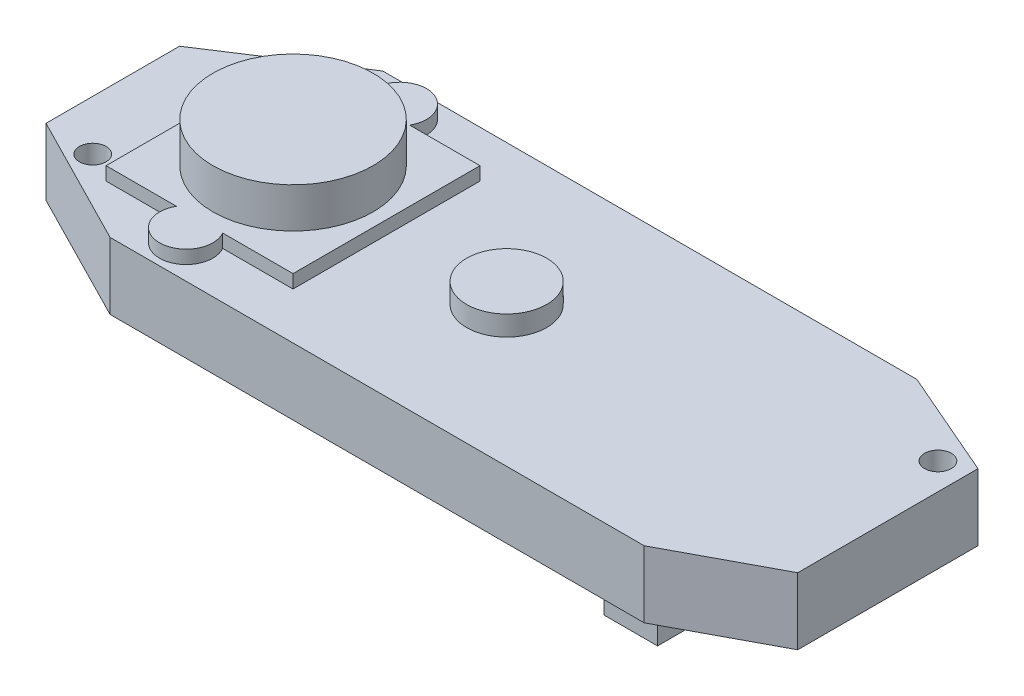
ISO-10303-21;
HEADER;
FILE_DESCRIPTION(('STEP AP214'),'2;1');
FILE_NAME('part.step','',(''),(''),'','','');
FILE_SCHEMA(('AUTOMOTIVE_DESIGN { 1 0 10303 214 1 1 1 1 }'));
ENDSEC;
DATA;
#1=APPLICATION_CONTEXT('core data for automotive mechanical design processes');
#2=APPLICATION_PROTOCOL_DEFINITION('international standard','automotive_design',2000,#1);
#3=PRODUCT_CONTEXT('',#1,'mechanical');
#4=PRODUCT('Part','Part','',(#3));
#5=PRODUCT_RELATED_PRODUCT_CATEGORY('part','',(#4));
#6=PRODUCT_DEFINITION_FORMATION('','',#4);
#7=PRODUCT_DEFINITION_CONTEXT('part definition',#1,'design');
#8=PRODUCT_DEFINITION('design','',#6,#7);
#9=PRODUCT_DEFINITION_SHAPE('','',#8);
#10=(LENGTH_UNIT() NAMED_UNIT(*) SI_UNIT(.MILLI.,.METRE.));
#11=(NAMED_UNIT(*) PLANE_ANGLE_UNIT() SI_UNIT($,.RADIAN.));
#12=(NAMED_UNIT(*) SI_UNIT($,.STERADIAN.) SOLID_ANGLE_UNIT());
#13=UNCERTAINTY_MEASURE_WITH_UNIT(LENGTH_MEASURE(1.E-05),#10,'distance_accuracy_value','');
#14=(GEOMETRIC_REPRESENTATION_CONTEXT(3) GLOBAL_UNCERTAINTY_ASSIGNED_CONTEXT((#13)) GLOBAL_UNIT_ASSIGNED_CONTEXT((#10,
#11,#12)) REPRESENTATION_CONTEXT('',''));
#15=CARTESIAN_POINT('',(0.,0.,0.));
#16=DIRECTION('',(0.,0.,1.));
#17=DIRECTION('',(1.,0.,0.));
#18=AXIS2_PLACEMENT_3D('',#15,#16,#17);
#19=CARTESIAN_POINT('',(0.,0.,0.));
#20=DIRECTION('',(0.,-1.,0.));
#21=DIRECTION('',(0.,0.,-1.));
#22=AXIS2_PLACEMENT_3D('',#19,#20,#21);
#23=PLANE('',#22);
#24=CARTESIAN_POINT('',(-26.0479589711327,0.,5.25));
#25=DIRECTION('',(0.,1.,0.));
#26=DIRECTION('',(0.,0.,1.));
#27=AXIS2_PLACEMENT_3D('',#24,#25,#26);
#28=CIRCLE('',#27,1.);
#29=CARTESIAN_POINT('',(-26.0479589711327,0.,6.25));
#30=VERTEX_POINT('',#29);
#31=EDGE_CURVE('E647',#30,#30,#28,.T.);
#32=ORIENTED_EDGE('',*,*,#31,.T.);
#33=EDGE_LOOP('',(#32));
#34=FACE_BOUND('',#33,.T.);
#35=CARTESIAN_POINT('',(25.5,0.,-6.50000000000001));
#36=DIRECTION('',(0.,1.,0.));
#37=DIRECTION('',(0.,0.,1.));
#38=AXIS2_PLACEMENT_3D('',#35,#36,#37);
#39=CIRCLE('',#38,1.);
#40=CARTESIAN_POINT('',(25.5,0.,-5.50000000000001));
#41=VERTEX_POINT('',#40);
#42=EDGE_CURVE('E658',#41,#41,#39,.T.);
#43=ORIENTED_EDGE('',*,*,#42,.T.);
#44=EDGE_LOOP('',(#43));
#45=FACE_BOUND('',#44,.T.);
#46=DIRECTION('',(0.890723542830247,0.,0.454545454545455));
#47=VECTOR('',#46,1.);
#48=CARTESIAN_POINT('',(-20.,0.,10.));
#49=LINE('',#48,#47);
#50=CARTESIAN_POINT('',(-29.7979589711327,0.,5.));
#51=VERTEX_POINT('',#50);
#52=CARTESIAN_POINT('',(-20.,0.,10.));
#53=VERTEX_POINT('',#52);
#54=EDGE_CURVE('E313',#51,#53,#49,.T.);
#55=ORIENTED_EDGE('',*,*,#54,.F.);
#56=DIRECTION('',(0.,0.,1.));
#57=VECTOR('',#56,1.);
#58=CARTESIAN_POINT('',(-29.7979589711327,0.,5.));
#59=LINE('',#58,#57);
#60=CARTESIAN_POINT('',(-29.7979589711327,0.,-5.));
#61=VERTEX_POINT('',#60);
#62=EDGE_CURVE('E319',#61,#51,#59,.T.);
#63=ORIENTED_EDGE('',*,*,#62,.F.);
#64=DIRECTION('',(-0.838140405208445,0.,0.545454545454545));
#65=VECTOR('',#64,1.);
#66=CARTESIAN_POINT('',(-29.7979589711327,0.,-5.));
#67=LINE('',#66,#65);
#68=CARTESIAN_POINT('',(-20.5784145138398,0.,-11.));
#69=VERTEX_POINT('',#68);
#70=EDGE_CURVE('E359',#69,#61,#67,.T.);
#71=ORIENTED_EDGE('',*,*,#70,.F.);
#72=DIRECTION('',(-1.,0.,0.));
#73=VECTOR('',#72,1.);
#74=CARTESIAN_POINT('',(-20.5784145138398,0.,-11.));
#75=LINE('',#74,#73);
#76=CARTESIAN_POINT('',(19.4215854861602,0.,-11.));
#77=VERTEX_POINT('',#76);
#78=EDGE_CURVE('E356',#77,#69,#75,.T.);
#79=ORIENTED_EDGE('',*,*,#78,.F.);
#80=DIRECTION('',(-0.917582404601097,0.,-0.397545633564838));
#81=VECTOR('',#80,1.);
#82=CARTESIAN_POINT('',(19.4215854861602,0.,-11.));
#83=LINE('',#82,#81);
#84=CARTESIAN_POINT('',(27.5,0.,-7.50000000000001));
#85=VERTEX_POINT('',#84);
#86=EDGE_CURVE('E353',#85,#77,#83,.T.);
#87=ORIENTED_EDGE('',*,*,#86,.F.);
#88=DIRECTION('',(0.,0.,-1.));
#89=VECTOR('',#88,1.);
#90=CARTESIAN_POINT('',(27.5,0.,-7.50000000000001));
#91=LINE('',#90,#89);
#92=CARTESIAN_POINT('',(27.5,0.,5.99999999999999));
#93=VERTEX_POINT('',#92);
#94=EDGE_CURVE('E350',#93,#85,#91,.T.);
#95=ORIENTED_EDGE('',*,*,#94,.F.);
#96=DIRECTION('',(0.88235294117647,0.,-0.470588235294119));
#97=VECTOR('',#96,1.);
#98=CARTESIAN_POINT('',(27.5,0.,5.99999999999999));
#99=LINE('',#98,#97);
#100=CARTESIAN_POINT('',(20.,0.,10.));
#101=VERTEX_POINT('',#100);
#102=EDGE_CURVE('E347',#101,#93,#99,.T.);
#103=ORIENTED_EDGE('',*,*,#102,.F.);
#104=DIRECTION('',(1.,0.,0.));
#105=VECTOR('',#104,1.);
#106=CARTESIAN_POINT('',(20.,0.,10.));
#107=LINE('',#106,#105);
#108=EDGE_CURVE('E344',#53,#101,#107,.T.);
#109=ORIENTED_EDGE('',*,*,#108,.F.);
#110=EDGE_LOOP('',(#55,#63,#71,#79,#87,#95,#103,#109));
#111=FACE_BOUND('',#110,.T.);
#112=DIRECTION('',(-1.,0.,0.));
#113=VECTOR('',#112,1.);
#114=CARTESIAN_POINT('',(19.5,0.,8.5));
#115=LINE('',#114,#113);
#116=CARTESIAN_POINT('',(19.5,0.,8.5));
#117=VERTEX_POINT('',#116);
#118=CARTESIAN_POINT('',(15.5,0.,8.5));
#119=VERTEX_POINT('',#118);
#120=EDGE_CURVE('E671',#117,#119,#115,.T.);
#121=ORIENTED_EDGE('',*,*,#120,.F.);
#122=DIRECTION('',(0.,0.,1.));
#123=VECTOR('',#122,1.);
#124=CARTESIAN_POINT('',(19.5,0.,8.5));
#125=LINE('',#124,#123);
#126=CARTESIAN_POINT('',(19.5,0.,2.5));
#127=VERTEX_POINT('',#126);
#128=EDGE_CURVE('E207',#127,#117,#125,.T.);
#129=ORIENTED_EDGE('',*,*,#128,.F.);
#130=DIRECTION('',(1.,0.,0.));
#131=VECTOR('',#130,1.);
#132=CARTESIAN_POINT('',(19.5,0.,2.5));
#133=LINE('',#132,#131);
#134=CARTESIAN_POINT('',(15.5,0.,2.5));
#135=VERTEX_POINT('',#134);
#136=EDGE_CURVE('E203',#135,#127,#133,.T.);
#137=ORIENTED_EDGE('',*,*,#136,.F.);
#138=DIRECTION('',(0.,0.,-1.));
#139=VECTOR('',#138,1.);
#140=CARTESIAN_POINT('',(15.5,0.,8.5));
#141=LINE('',#140,#139);
#142=EDGE_CURVE('E674',#119,#135,#141,.T.);
#143=ORIENTED_EDGE('',*,*,#142,.F.);
#144=EDGE_LOOP('',(#121,#129,#137,#143));
#145=FACE_BOUND('',#144,.T.);
#146=ADVANCED_FACE('F44',(#34,#45,#111,#145),#23,.T.);
#147=CARTESIAN_POINT('',(0.,5.,0.));
#148=DIRECTION('',(0.,-1.,0.));
#149=DIRECTION('',(0.,0.,-1.));
#150=AXIS2_PLACEMENT_3D('',#147,#148,#149);
#151=PLANE('',#150);
#152=CARTESIAN_POINT('',(-26.0479589711327,5.,5.25));
#153=DIRECTION('',(0.,1.,0.));
#154=DIRECTION('',(0.,0.,1.));
#155=AXIS2_PLACEMENT_3D('',#152,#153,#154);
#156=CIRCLE('',#155,1.);
#157=CARTESIAN_POINT('',(-26.0479589711327,5.,6.25));
#158=VERTEX_POINT('',#157);
#159=EDGE_CURVE('E650',#158,#158,#156,.T.);
#160=ORIENTED_EDGE('',*,*,#159,.F.);
#161=EDGE_LOOP('',(#160));
#162=FACE_BOUND('',#161,.T.);
#163=CARTESIAN_POINT('',(25.5,5.,-6.50000000000001));
#164=DIRECTION('',(0.,1.,0.));
#165=DIRECTION('',(0.,0.,1.));
#166=AXIS2_PLACEMENT_3D('',#163,#164,#165);
#167=CIRCLE('',#166,1.);
#168=CARTESIAN_POINT('',(25.5,5.,-5.50000000000001));
#169=VERTEX_POINT('',#168);
#170=EDGE_CURVE('E652',#169,#169,#167,.T.);
#171=ORIENTED_EDGE('',*,*,#170,.F.);
#172=EDGE_LOOP('',(#171));
#173=FACE_BOUND('',#172,.T.);
#174=CARTESIAN_POINT('',(-0.797958971132716,5.,-0.499999999999999));
#175=DIRECTION('',(0.,-1.,0.));
#176=DIRECTION('',(0.,0.,-1.));
#177=AXIS2_PLACEMENT_3D('',#174,#175,#176);
#178=CIRCLE('',#177,3.);
#179=CARTESIAN_POINT('',(-0.797958971132716,5.,-3.5));
#180=VERTEX_POINT('',#179);
#181=EDGE_CURVE('E11',#180,#180,#178,.F.);
#182=ORIENTED_EDGE('',*,*,#181,.F.);
#183=EDGE_LOOP('',(#182));
#184=FACE_BOUND('',#183,.T.);
#185=DIRECTION('',(0.890723542830247,0.,0.454545454545455));
#186=VECTOR('',#185,1.);
#187=CARTESIAN_POINT('',(-20.,5.,10.));
#188=LINE('',#187,#186);
#189=CARTESIAN_POINT('',(-29.7979589711327,5.,5.));
#190=VERTEX_POINT('',#189);
#191=CARTESIAN_POINT('',(-20.,5.,10.));
#192=VERTEX_POINT('',#191);
#193=EDGE_CURVE('E314',#190,#192,#188,.T.);
#194=ORIENTED_EDGE('',*,*,#193,.T.);
#195=DIRECTION('',(1.,0.,0.));
#196=VECTOR('',#195,1.);
#197=CARTESIAN_POINT('',(20.,5.,10.));
#198=LINE('',#197,#196);
#199=CARTESIAN_POINT('',(20.,5.,10.));
#200=VERTEX_POINT('',#199);
#201=EDGE_CURVE('E318',#192,#200,#198,.T.);
#202=ORIENTED_EDGE('',*,*,#201,.T.);
#203=DIRECTION('',(0.88235294117647,0.,-0.470588235294119));
#204=VECTOR('',#203,1.);
#205=CARTESIAN_POINT('',(27.5,5.,5.99999999999999));
#206=LINE('',#205,#204);
#207=CARTESIAN_POINT('',(27.5,5.,5.99999999999999));
#208=VERTEX_POINT('',#207);
#209=EDGE_CURVE('E322',#200,#208,#206,.T.);
#210=ORIENTED_EDGE('',*,*,#209,.T.);
#211=DIRECTION('',(0.,0.,-1.));
#212=VECTOR('',#211,1.);
#213=CARTESIAN_POINT('',(27.5,5.,-7.50000000000001));
#214=LINE('',#213,#212);
#215=CARTESIAN_POINT('',(27.5,5.,-7.50000000000001));
#216=VERTEX_POINT('',#215);
#217=EDGE_CURVE('E325',#208,#216,#214,.T.);
#218=ORIENTED_EDGE('',*,*,#217,.T.);
#219=DIRECTION('',(-0.917582404601097,0.,-0.397545633564838));
#220=VECTOR('',#219,1.);
#221=CARTESIAN_POINT('',(19.4215854861602,5.,-11.));
#222=LINE('',#221,#220);
#223=CARTESIAN_POINT('',(19.4215854861602,5.,-11.));
#224=VERTEX_POINT('',#223);
#225=EDGE_CURVE('E328',#216,#224,#222,.T.);
#226=ORIENTED_EDGE('',*,*,#225,.T.);
#227=DIRECTION('',(-1.,0.,0.));
#228=VECTOR('',#227,1.);
#229=CARTESIAN_POINT('',(-20.5784145138398,5.,-11.));
#230=LINE('',#229,#228);
#231=CARTESIAN_POINT('',(-20.5784145138398,5.,-11.));
#232=VERTEX_POINT('',#231);
#233=EDGE_CURVE('E331',#224,#232,#230,.T.);
#234=ORIENTED_EDGE('',*,*,#233,.T.);
#235=DIRECTION('',(-0.838140405208445,0.,0.545454545454545));
#236=VECTOR('',#235,1.);
#237=CARTESIAN_POINT('',(-29.7979589711327,5.,-5.));
#238=LINE('',#237,#236);
#239=CARTESIAN_POINT('',(-29.7979589711327,5.,-5.));
#240=VERTEX_POINT('',#239);
#241=EDGE_CURVE('E334',#232,#240,#238,.T.);
#242=ORIENTED_EDGE('',*,*,#241,.T.);
#243=DIRECTION('',(0.,0.,1.));
#244=VECTOR('',#243,1.);
#245=CARTESIAN_POINT('',(-29.7979589711327,5.,5.));
#246=LINE('',#245,#244);
#247=EDGE_CURVE('E337',#240,#190,#246,.T.);
#248=ORIENTED_EDGE('',*,*,#247,.T.);
#249=EDGE_LOOP('',(#194,#202,#210,#218,#226,#234,#242,#248));
#250=FACE_BOUND('',#249,.T.);
#251=DIRECTION('',(0.,0.,1.));
#252=VECTOR('',#251,1.);
#253=CARTESIAN_POINT('',(-23.7979589711327,5.,-7.5));
#254=LINE('',#253,#252);
#255=CARTESIAN_POINT('',(-23.7979589711327,5.,-7.5));
#256=VERTEX_POINT('',#255);
#257=CARTESIAN_POINT('',(-23.7979589711327,5.,6.5));
#258=VERTEX_POINT('',#257);
#259=EDGE_CURVE('E68',#256,#258,#254,.T.);
#260=ORIENTED_EDGE('',*,*,#259,.F.);
#261=DIRECTION('',(-1.,0.,0.));
#262=VECTOR('',#261,1.);
#263=CARTESIAN_POINT('',(-23.7979589711327,5.,-7.5));
#264=LINE('',#263,#262);
#265=CARTESIAN_POINT('',(-18.5300097787016,5.,-7.5));
#266=VERTEX_POINT('',#265);
#267=EDGE_CURVE('E232',#266,#256,#264,.T.);
#268=ORIENTED_EDGE('',*,*,#267,.F.);
#269=CARTESIAN_POINT('',(-16.7979589711327,5.,-8.5));
#270=DIRECTION('',(0.,1.,0.));
#271=DIRECTION('',(0.,0.,1.));
#272=AXIS2_PLACEMENT_3D('',#269,#270,#271);
#273=CIRCLE('',#272,2.);
#274=CARTESIAN_POINT('',(-15.0659081635638,5.,-7.5));
#275=VERTEX_POINT('',#274);
#276=EDGE_CURVE('E276',#275,#266,#273,.T.);
#277=ORIENTED_EDGE('',*,*,#276,.F.);
#278=DIRECTION('',(-1.,0.,0.));
#279=VECTOR('',#278,1.);
#280=CARTESIAN_POINT('',(-15.0659081635638,5.,-7.5));
#281=LINE('',#280,#279);
#282=CARTESIAN_POINT('',(-9.79795897113272,5.,-7.5));
#283=VERTEX_POINT('',#282);
#284=EDGE_CURVE('E272',#283,#275,#281,.T.);
#285=ORIENTED_EDGE('',*,*,#284,.F.);
#286=DIRECTION('',(0.,0.,-1.));
#287=VECTOR('',#286,1.);
#288=CARTESIAN_POINT('',(-9.79795897113272,5.,-7.5));
#289=LINE('',#288,#287);
#290=CARTESIAN_POINT('',(-9.79795897113272,5.,6.5));
#291=VERTEX_POINT('',#290);
#292=EDGE_CURVE('E268',#291,#283,#289,.T.);
#293=ORIENTED_EDGE('',*,*,#292,.F.);
#294=DIRECTION('',(1.,0.,0.));
#295=VECTOR('',#294,1.);
#296=CARTESIAN_POINT('',(-15.0659081635638,5.,6.5));
#297=LINE('',#296,#295);
#298=CARTESIAN_POINT('',(-15.0659081635638,5.,6.5));
#299=VERTEX_POINT('',#298);
#300=EDGE_CURVE('E264',#299,#291,#297,.T.);
#301=ORIENTED_EDGE('',*,*,#300,.F.);
#302=CARTESIAN_POINT('',(-16.7979589711327,5.,7.5));
#303=DIRECTION('',(0.,1.,0.));
#304=DIRECTION('',(0.,0.,-1.));
#305=AXIS2_PLACEMENT_3D('',#302,#303,#304);
#306=CIRCLE('',#305,2.);
#307=CARTESIAN_POINT('',(-18.5300097787016,5.,6.5));
#308=VERTEX_POINT('',#307);
#309=EDGE_CURVE('E260',#308,#299,#306,.T.);
#310=ORIENTED_EDGE('',*,*,#309,.F.);
#311=DIRECTION('',(1.,0.,0.));
#312=VECTOR('',#311,1.);
#313=CARTESIAN_POINT('',(-23.7979589711327,5.,6.5));
#314=LINE('',#313,#312);
#315=EDGE_CURVE('E256',#258,#308,#314,.T.);
#316=ORIENTED_EDGE('',*,*,#315,.F.);
#317=EDGE_LOOP('',(#260,#268,#277,#285,#293,#301,#310,#316));
#318=FACE_BOUND('',#317,.T.);
#319=ADVANCED_FACE('F417',(#162,#173,#184,#250,#318),#151,.F.);
#320=CARTESIAN_POINT('',(-20.,5.,10.));
#321=DIRECTION('',(0.454545454545455,0.,-0.890723542830247));
#322=DIRECTION('',(-0.890723542830247,0.,-0.454545454545455));
#323=AXIS2_PLACEMENT_3D('',#320,#321,#322);
#324=PLANE('',#323);
#325=ORIENTED_EDGE('',*,*,#54,.T.);
#326=DIRECTION('',(0.,-1.,0.));
#327=VECTOR('',#326,1.);
#328=CARTESIAN_POINT('',(-20.,5.,10.));
#329=LINE('',#328,#327);
#330=EDGE_CURVE('E226',#192,#53,#329,.T.);
#331=ORIENTED_EDGE('',*,*,#330,.F.);
#332=ORIENTED_EDGE('',*,*,#193,.F.);
#333=DIRECTION('',(0.,-1.,0.));
#334=VECTOR('',#333,1.);
#335=CARTESIAN_POINT('',(-29.7979589711327,5.,5.));
#336=LINE('',#335,#334);
#337=EDGE_CURVE('E340',#190,#51,#336,.T.);
#338=ORIENTED_EDGE('',*,*,#337,.T.);
#339=EDGE_LOOP('',(#325,#331,#332,#338));
#340=FACE_BOUND('',#339,.T.);
#341=ADVANCED_FACE('F46',(#340),#324,.F.);
#342=CARTESIAN_POINT('',(20.,5.,10.));
#343=DIRECTION('',(0.,0.,-1.));
#344=DIRECTION('',(-1.,0.,0.));
#345=AXIS2_PLACEMENT_3D('',#342,#343,#344);
#346=PLANE('',#345);
#347=ORIENTED_EDGE('',*,*,#108,.T.);
#348=DIRECTION('',(0.,-1.,0.));
#349=VECTOR('',#348,1.);
#350=CARTESIAN_POINT('',(20.,5.,10.));
#351=LINE('',#350,#349);
#352=EDGE_CURVE('E387',#200,#101,#351,.T.);
#353=ORIENTED_EDGE('',*,*,#352,.F.);
#354=ORIENTED_EDGE('',*,*,#201,.F.);
#355=ORIENTED_EDGE('',*,*,#330,.T.);
#356=EDGE_LOOP('',(#347,#353,#354,#355));
#357=FACE_BOUND('',#356,.T.);
#358=ADVANCED_FACE('F394',(#357),#346,.F.);
#359=CARTESIAN_POINT('',(27.5,5.,5.99999999999999));
#360=DIRECTION('',(-0.470588235294119,0.,-0.88235294117647));
#361=DIRECTION('',(-0.88235294117647,0.,0.470588235294119));
#362=AXIS2_PLACEMENT_3D('',#359,#360,#361);
#363=PLANE('',#362);
#364=ORIENTED_EDGE('',*,*,#102,.T.);
#365=DIRECTION('',(0.,-1.,0.));
#366=VECTOR('',#365,1.);
#367=CARTESIAN_POINT('',(27.5,5.,5.99999999999999));
#368=LINE('',#367,#366);
#369=EDGE_CURVE('E383',#208,#93,#368,.T.);
#370=ORIENTED_EDGE('',*,*,#369,.F.);
#371=ORIENTED_EDGE('',*,*,#209,.F.);
#372=ORIENTED_EDGE('',*,*,#352,.T.);
#373=EDGE_LOOP('',(#364,#370,#371,#372));
#374=FACE_BOUND('',#373,.T.);
#375=ADVANCED_FACE('F409',(#374),#363,.F.);
#376=CARTESIAN_POINT('',(27.5,5.,-7.50000000000001));
#377=DIRECTION('',(-1.,0.,0.));
#378=DIRECTION('',(0.,0.,1.));
#379=AXIS2_PLACEMENT_3D('',#376,#377,#378);
#380=PLANE('',#379);
#381=ORIENTED_EDGE('',*,*,#94,.T.);
#382=DIRECTION('',(0.,-1.,0.));
#383=VECTOR('',#382,1.);
#384=CARTESIAN_POINT('',(27.5,5.,-7.50000000000001));
#385=LINE('',#384,#383);
#386=EDGE_CURVE('E379',#216,#85,#385,.T.);
#387=ORIENTED_EDGE('',*,*,#386,.F.);
#388=ORIENTED_EDGE('',*,*,#217,.F.);
#389=ORIENTED_EDGE('',*,*,#369,.T.);
#390=EDGE_LOOP('',(#381,#387,#388,#389));
#391=FACE_BOUND('',#390,.T.);
#392=ADVANCED_FACE('F413',(#391),#380,.F.);
#393=CARTESIAN_POINT('',(19.4215854861602,5.,-11.));
#394=DIRECTION('',(-0.397545633564838,0.,0.917582404601097));
#395=DIRECTION('',(0.917582404601097,0.,0.397545633564838));
#396=AXIS2_PLACEMENT_3D('',#393,#394,#395);
#397=PLANE('',#396);
#398=ORIENTED_EDGE('',*,*,#86,.T.);
#399=DIRECTION('',(0.,-1.,0.));
#400=VECTOR('',#399,1.);
#401=CARTESIAN_POINT('',(19.4215854861602,5.,-11.));
#402=LINE('',#401,#400);
#403=EDGE_CURVE('E375',#224,#77,#402,.T.);
#404=ORIENTED_EDGE('',*,*,#403,.F.);
#405=ORIENTED_EDGE('',*,*,#225,.F.);
#406=ORIENTED_EDGE('',*,*,#386,.T.);
#407=EDGE_LOOP('',(#398,#404,#405,#406));
#408=FACE_BOUND('',#407,.T.);
#409=ADVANCED_FACE('F432',(#408),#397,.F.);
#410=CARTESIAN_POINT('',(-20.5784145138398,5.,-11.));
#411=DIRECTION('',(0.,0.,1.));
#412=DIRECTION('',(1.,0.,0.));
#413=AXIS2_PLACEMENT_3D('',#410,#411,#412);
#414=PLANE('',#413);
#415=ORIENTED_EDGE('',*,*,#78,.T.);
#416=DIRECTION('',(0.,-1.,0.));
#417=VECTOR('',#416,1.);
#418=CARTESIAN_POINT('',(-20.5784145138398,5.,-11.));
#419=LINE('',#418,#417);
#420=EDGE_CURVE('E371',#232,#69,#419,.T.);
#421=ORIENTED_EDGE('',*,*,#420,.F.);
#422=ORIENTED_EDGE('',*,*,#233,.F.);
#423=ORIENTED_EDGE('',*,*,#403,.T.);
#424=EDGE_LOOP('',(#415,#421,#422,#423));
#425=FACE_BOUND('',#424,.T.);
#426=ADVANCED_FACE('F429',(#425),#414,.F.);
#427=CARTESIAN_POINT('',(-29.7979589711327,5.,-5.));
#428=DIRECTION('',(0.545454545454545,0.,0.838140405208445));
#429=DIRECTION('',(0.838140405208445,0.,-0.545454545454545));
#430=AXIS2_PLACEMENT_3D('',#427,#428,#429);
#431=PLANE('',#430);
#432=ORIENTED_EDGE('',*,*,#70,.T.);
#433=DIRECTION('',(0.,-1.,0.));
#434=VECTOR('',#433,1.);
#435=CARTESIAN_POINT('',(-29.7979589711327,5.,-5.));
#436=LINE('',#435,#434);
#437=EDGE_CURVE('E367',#240,#61,#436,.T.);
#438=ORIENTED_EDGE('',*,*,#437,.F.);
#439=ORIENTED_EDGE('',*,*,#241,.F.);
#440=ORIENTED_EDGE('',*,*,#420,.T.);
#441=EDGE_LOOP('',(#432,#438,#439,#440));
#442=FACE_BOUND('',#441,.T.);
#443=ADVANCED_FACE('F425',(#442),#431,.F.);
#444=CARTESIAN_POINT('',(-29.7979589711327,5.,5.));
#445=DIRECTION('',(1.,0.,0.));
#446=DIRECTION('',(0.,0.,-1.));
#447=AXIS2_PLACEMENT_3D('',#444,#445,#446);
#448=PLANE('',#447);
#449=ORIENTED_EDGE('',*,*,#62,.T.);
#450=ORIENTED_EDGE('',*,*,#337,.F.);
#451=ORIENTED_EDGE('',*,*,#247,.F.);
#452=ORIENTED_EDGE('',*,*,#437,.T.);
#453=EDGE_LOOP('',(#449,#450,#451,#452));
#454=FACE_BOUND('',#453,.T.);
#455=ADVANCED_FACE('F423',(#454),#448,.F.);
#456=CARTESIAN_POINT('',(-23.7979589711327,6.,-7.5));
#457=DIRECTION('',(1.,0.,0.));
#458=DIRECTION('',(0.,0.,-1.));
#459=AXIS2_PLACEMENT_3D('',#456,#457,#458);
#460=PLANE('',#459);
#461=ORIENTED_EDGE('',*,*,#259,.T.);
#462=DIRECTION('',(0.,-1.,0.));
#463=VECTOR('',#462,1.);
#464=CARTESIAN_POINT('',(-23.7979589711327,6.,6.5));
#465=LINE('',#464,#463);
#466=CARTESIAN_POINT('',(-23.7979589711327,6.,6.5));
#467=VERTEX_POINT('',#466);
#468=EDGE_CURVE('E309',#467,#258,#465,.T.);
#469=ORIENTED_EDGE('',*,*,#468,.F.);
#470=DIRECTION('',(0.,0.,1.));
#471=VECTOR('',#470,1.);
#472=CARTESIAN_POINT('',(-23.7979589711327,6.,-7.5));
#473=LINE('',#472,#471);
#474=CARTESIAN_POINT('',(-23.7979589711327,6.,-7.5));
#475=VERTEX_POINT('',#474);
#476=EDGE_CURVE('E227',#475,#467,#473,.T.);
#477=ORIENTED_EDGE('',*,*,#476,.F.);
#478=DIRECTION('',(0.,-1.,0.));
#479=VECTOR('',#478,1.);
#480=CARTESIAN_POINT('',(-23.7979589711327,6.,-7.5));
#481=LINE('',#480,#479);
#482=EDGE_CURVE('E253',#475,#256,#481,.T.);
#483=ORIENTED_EDGE('',*,*,#482,.T.);
#484=EDGE_LOOP('',(#461,#469,#477,#483));
#485=FACE_BOUND('',#484,.T.);
#486=ADVANCED_FACE('F456',(#485),#460,.F.);
#487=CARTESIAN_POINT('',(-23.7979589711327,6.,6.5));
#488=DIRECTION('',(0.,0.,-1.));
#489=DIRECTION('',(-1.,0.,0.));
#490=AXIS2_PLACEMENT_3D('',#487,#488,#489);
#491=PLANE('',#490);
#492=ORIENTED_EDGE('',*,*,#315,.T.);
#493=DIRECTION('',(0.,-1.,0.));
#494=VECTOR('',#493,1.);
#495=CARTESIAN_POINT('',(-18.5300097787016,6.,6.5));
#496=LINE('',#495,#494);
#497=CARTESIAN_POINT('',(-18.5300097787016,6.,6.5));
#498=VERTEX_POINT('',#497);
#499=EDGE_CURVE('E305',#498,#308,#496,.T.);
#500=ORIENTED_EDGE('',*,*,#499,.F.);
#501=DIRECTION('',(1.,0.,0.));
#502=VECTOR('',#501,1.);
#503=CARTESIAN_POINT('',(-23.7979589711327,6.,6.5));
#504=LINE('',#503,#502);
#505=EDGE_CURVE('E231',#467,#498,#504,.T.);
#506=ORIENTED_EDGE('',*,*,#505,.F.);
#507=ORIENTED_EDGE('',*,*,#468,.T.);
#508=EDGE_LOOP('',(#492,#500,#506,#507));
#509=FACE_BOUND('',#508,.T.);
#510=ADVANCED_FACE('F475',(#509),#491,.F.);
#511=CARTESIAN_POINT('',(-16.7979589711327,6.,7.5));
#512=DIRECTION('',(0.,-1.,0.));
#513=DIRECTION('',(0.,0.,-1.));
#514=AXIS2_PLACEMENT_3D('',#511,#512,#513);
#515=CYLINDRICAL_SURFACE('',#514,2.);
#516=ORIENTED_EDGE('',*,*,#309,.T.);
#517=DIRECTION('',(0.,-1.,0.));
#518=VECTOR('',#517,1.);
#519=CARTESIAN_POINT('',(-15.0659081635638,6.,6.5));
#520=LINE('',#519,#518);
#521=CARTESIAN_POINT('',(-15.0659081635638,6.,6.5));
#522=VERTEX_POINT('',#521);
#523=EDGE_CURVE('E301',#522,#299,#520,.T.);
#524=ORIENTED_EDGE('',*,*,#523,.F.);
#525=CARTESIAN_POINT('',(-16.7979589711327,6.,7.5));
#526=DIRECTION('',(0.,1.,0.));
#527=DIRECTION('',(0.,0.,-1.));
#528=AXIS2_PLACEMENT_3D('',#525,#526,#527);
#529=CIRCLE('',#528,2.);
#530=EDGE_CURVE('E235',#498,#522,#529,.T.);
#531=ORIENTED_EDGE('',*,*,#530,.F.);
#532=ORIENTED_EDGE('',*,*,#499,.T.);
#533=EDGE_LOOP('',(#516,#524,#531,#532));
#534=FACE_BOUND('',#533,.T.);
#535=ADVANCED_FACE('F483',(#534),#515,.T.);
#536=CARTESIAN_POINT('',(-15.0659081635638,6.,6.5));
#537=DIRECTION('',(0.,0.,-1.));
#538=DIRECTION('',(-1.,0.,0.));
#539=AXIS2_PLACEMENT_3D('',#536,#537,#538);
#540=PLANE('',#539);
#541=ORIENTED_EDGE('',*,*,#300,.T.);
#542=DIRECTION('',(0.,-1.,0.));
#543=VECTOR('',#542,1.);
#544=CARTESIAN_POINT('',(-9.79795897113272,6.,6.5));
#545=LINE('',#544,#543);
#546=CARTESIAN_POINT('',(-9.79795897113272,6.,6.5));
#547=VERTEX_POINT('',#546);
#548=EDGE_CURVE('E297',#547,#291,#545,.T.);
#549=ORIENTED_EDGE('',*,*,#548,.F.);
#550=DIRECTION('',(1.,0.,0.));
#551=VECTOR('',#550,1.);
#552=CARTESIAN_POINT('',(-15.0659081635638,6.,6.5));
#553=LINE('',#552,#551);
#554=EDGE_CURVE('E238',#522,#547,#553,.T.);
#555=ORIENTED_EDGE('',*,*,#554,.F.);
#556=ORIENTED_EDGE('',*,*,#523,.T.);
#557=EDGE_LOOP('',(#541,#549,#555,#556));
#558=FACE_BOUND('',#557,.T.);
#559=ADVANCED_FACE('F492',(#558),#540,.F.);
#560=CARTESIAN_POINT('',(-9.79795897113272,6.,-7.5));
#561=DIRECTION('',(-1.,0.,0.));
#562=DIRECTION('',(0.,0.,1.));
#563=AXIS2_PLACEMENT_3D('',#560,#561,#562);
#564=PLANE('',#563);
#565=ORIENTED_EDGE('',*,*,#292,.T.);
#566=DIRECTION('',(0.,-1.,0.));
#567=VECTOR('',#566,1.);
#568=CARTESIAN_POINT('',(-9.79795897113272,6.,-7.5));
#569=LINE('',#568,#567);
#570=CARTESIAN_POINT('',(-9.79795897113272,6.,-7.5));
#571=VERTEX_POINT('',#570);
#572=EDGE_CURVE('E293',#571,#283,#569,.T.);
#573=ORIENTED_EDGE('',*,*,#572,.F.);
#574=DIRECTION('',(0.,0.,-1.));
#575=VECTOR('',#574,1.);
#576=CARTESIAN_POINT('',(-9.79795897113272,6.,-7.5));
#577=LINE('',#576,#575);
#578=EDGE_CURVE('E241',#547,#571,#577,.T.);
#579=ORIENTED_EDGE('',*,*,#578,.F.);
#580=ORIENTED_EDGE('',*,*,#548,.T.);
#581=EDGE_LOOP('',(#565,#573,#579,#580));
#582=FACE_BOUND('',#581,.T.);
#583=ADVANCED_FACE('F501',(#582),#564,.F.);
#584=CARTESIAN_POINT('',(-15.0659081635638,6.,-7.5));
#585=DIRECTION('',(0.,0.,1.));
#586=DIRECTION('',(1.,0.,0.));
#587=AXIS2_PLACEMENT_3D('',#584,#585,#586);
#588=PLANE('',#587);
#589=ORIENTED_EDGE('',*,*,#284,.T.);
#590=DIRECTION('',(0.,-1.,0.));
#591=VECTOR('',#590,1.);
#592=CARTESIAN_POINT('',(-15.0659081635638,6.,-7.5));
#593=LINE('',#592,#591);
#594=CARTESIAN_POINT('',(-15.0659081635638,6.,-7.5));
#595=VERTEX_POINT('',#594);
#596=EDGE_CURVE('E289',#595,#275,#593,.T.);
#597=ORIENTED_EDGE('',*,*,#596,.F.);
#598=DIRECTION('',(-1.,0.,0.));
#599=VECTOR('',#598,1.);
#600=CARTESIAN_POINT('',(-15.0659081635638,6.,-7.5));
#601=LINE('',#600,#599);
#602=EDGE_CURVE('E244',#571,#595,#601,.T.);
#603=ORIENTED_EDGE('',*,*,#602,.F.);
#604=ORIENTED_EDGE('',*,*,#572,.T.);
#605=EDGE_LOOP('',(#589,#597,#603,#604));
#606=FACE_BOUND('',#605,.T.);
#607=ADVANCED_FACE('F510',(#606),#588,.F.);
#608=CARTESIAN_POINT('',(-16.7979589711327,6.,-8.5));
#609=DIRECTION('',(0.,-1.,0.));
#610=DIRECTION('',(0.,0.,-1.));
#611=AXIS2_PLACEMENT_3D('',#608,#609,#610);
#612=CYLINDRICAL_SURFACE('',#611,2.);
#613=ORIENTED_EDGE('',*,*,#276,.T.);
#614=DIRECTION('',(0.,-1.,0.));
#615=VECTOR('',#614,1.);
#616=CARTESIAN_POINT('',(-18.5300097787016,6.,-7.5));
#617=LINE('',#616,#615);
#618=CARTESIAN_POINT('',(-18.5300097787016,6.,-7.5));
#619=VERTEX_POINT('',#618);
#620=EDGE_CURVE('E285',#619,#266,#617,.T.);
#621=ORIENTED_EDGE('',*,*,#620,.F.);
#622=CARTESIAN_POINT('',(-16.7979589711327,6.,-8.5));
#623=DIRECTION('',(0.,1.,0.));
#624=DIRECTION('',(0.,0.,1.));
#625=AXIS2_PLACEMENT_3D('',#622,#623,#624);
#626=CIRCLE('',#625,2.);
#627=EDGE_CURVE('E247',#595,#619,#626,.T.);
#628=ORIENTED_EDGE('',*,*,#627,.F.);
#629=ORIENTED_EDGE('',*,*,#596,.T.);
#630=EDGE_LOOP('',(#613,#621,#628,#629));
#631=FACE_BOUND('',#630,.T.);
#632=ADVANCED_FACE('F519',(#631),#612,.T.);
#633=CARTESIAN_POINT('',(-23.7979589711327,6.,-7.5));
#634=DIRECTION('',(0.,0.,1.));
#635=DIRECTION('',(1.,0.,0.));
#636=AXIS2_PLACEMENT_3D('',#633,#634,#635);
#637=PLANE('',#636);
#638=ORIENTED_EDGE('',*,*,#267,.T.);
#639=ORIENTED_EDGE('',*,*,#482,.F.);
#640=DIRECTION('',(-1.,0.,0.));
#641=VECTOR('',#640,1.);
#642=CARTESIAN_POINT('',(-23.7979589711327,6.,-7.5));
#643=LINE('',#642,#641);
#644=EDGE_CURVE('E250',#619,#475,#643,.T.);
#645=ORIENTED_EDGE('',*,*,#644,.F.);
#646=ORIENTED_EDGE('',*,*,#620,.T.);
#647=EDGE_LOOP('',(#638,#639,#645,#646));
#648=FACE_BOUND('',#647,.T.);
#649=ADVANCED_FACE('F528',(#648),#637,.F.);
#650=CARTESIAN_POINT('',(-16.7979589711327,6.,7.5));
#651=DIRECTION('',(0.,-1.,0.));
#652=DIRECTION('',(0.,0.,-1.));
#653=AXIS2_PLACEMENT_3D('',#650,#651,#652);
#654=PLANE('',#653);
#655=CARTESIAN_POINT('',(-16.7979589711293,6.,-0.499999999999945));
#656=DIRECTION('',(0.,1.,0.));
#657=DIRECTION('',(0.,0.,1.));
#658=AXIS2_PLACEMENT_3D('',#655,#656,#657);
#659=CIRCLE('',#658,6.);
#660=CARTESIAN_POINT('',(-16.7979589711293,6.,5.50000000000006));
#661=VERTEX_POINT('',#660);
#662=EDGE_CURVE('E53',#661,#661,#659,.T.);
#663=ORIENTED_EDGE('',*,*,#662,.F.);
#664=EDGE_LOOP('',(#663));
#665=FACE_BOUND('',#664,.T.);
#666=ORIENTED_EDGE('',*,*,#476,.T.);
#667=ORIENTED_EDGE('',*,*,#505,.T.);
#668=ORIENTED_EDGE('',*,*,#530,.T.);
#669=ORIENTED_EDGE('',*,*,#554,.T.);
#670=ORIENTED_EDGE('',*,*,#578,.T.);
#671=ORIENTED_EDGE('',*,*,#602,.T.);
#672=ORIENTED_EDGE('',*,*,#627,.T.);
#673=ORIENTED_EDGE('',*,*,#644,.T.);
#674=EDGE_LOOP('',(#666,#667,#668,#669,#670,#671,#672,#673));
#675=FACE_BOUND('',#674,.T.);
#676=ADVANCED_FACE('F537',(#665,#675),#654,.F.);
#677=CARTESIAN_POINT('',(-16.7979589711293,9.,-0.499999999999945));
#678=DIRECTION('',(0.,-1.,0.));
#679=DIRECTION('',(0.,0.,-1.));
#680=AXIS2_PLACEMENT_3D('',#677,#678,#679);
#681=CYLINDRICAL_SURFACE('',#680,6.);
#682=CARTESIAN_POINT('',(-16.7979589711293,9.,-0.499999999999945));
#683=DIRECTION('',(0.,1.,0.));
#684=DIRECTION('',(0.,0.,1.));
#685=AXIS2_PLACEMENT_3D('',#682,#683,#684);
#686=CIRCLE('',#685,6.);
#687=CARTESIAN_POINT('',(-16.7979589711293,9.,5.50000000000006));
#688=VERTEX_POINT('',#687);
#689=EDGE_CURVE('E215',#688,#688,#686,.T.);
#690=ORIENTED_EDGE('',*,*,#689,.F.);
#691=EDGE_LOOP('',(#690));
#692=FACE_BOUND('',#691,.T.);
#693=ORIENTED_EDGE('',*,*,#662,.T.);
#694=EDGE_LOOP('',(#693));
#695=FACE_BOUND('',#694,.T.);
#696=ADVANCED_FACE('F546',(#692,#695),#681,.T.);
#697=CARTESIAN_POINT('',(-16.7979589711293,9.,-0.499999999999945));
#698=DIRECTION('',(0.,1.,0.));
#699=DIRECTION('',(0.,0.,1.));
#700=AXIS2_PLACEMENT_3D('',#697,#698,#699);
#701=PLANE('',#700);
#702=ORIENTED_EDGE('',*,*,#689,.T.);
#703=EDGE_LOOP('',(#702));
#704=FACE_BOUND('',#703,.T.);
#705=ADVANCED_FACE('F555',(#704),#701,.T.);
#706=CARTESIAN_POINT('',(-0.797958971132716,6.5,-0.499999999999999));
#707=DIRECTION('',(0.,-1.,0.));
#708=DIRECTION('',(0.,0.,-1.));
#709=AXIS2_PLACEMENT_3D('',#706,#707,#708);
#710=CYLINDRICAL_SURFACE('',#709,3.);
#711=CARTESIAN_POINT('',(-0.797958971132716,6.5,-0.499999999999999));
#712=DIRECTION('',(0.,1.,0.));
#713=DIRECTION('',(0.,0.,1.));
#714=AXIS2_PLACEMENT_3D('',#711,#712,#713);
#715=CIRCLE('',#714,3.);
#716=CARTESIAN_POINT('',(-0.797958971132716,6.5,2.5));
#717=VERTEX_POINT('',#716);
#718=EDGE_CURVE('E210',#717,#717,#715,.T.);
#719=ORIENTED_EDGE('',*,*,#718,.F.);
#720=EDGE_LOOP('',(#719));
#721=FACE_BOUND('',#720,.T.);
#722=ORIENTED_EDGE('',*,*,#181,.T.);
#723=EDGE_LOOP('',(#722));
#724=FACE_BOUND('',#723,.T.);
#725=ADVANCED_FACE('F564',(#721,#724),#710,.T.);
#726=CARTESIAN_POINT('',(-0.797958971132716,6.5,-0.499999999999999));
#727=DIRECTION('',(0.,1.,0.));
#728=DIRECTION('',(0.,0.,1.));
#729=AXIS2_PLACEMENT_3D('',#726,#727,#728);
#730=PLANE('',#729);
#731=ORIENTED_EDGE('',*,*,#718,.T.);
#732=EDGE_LOOP('',(#731));
#733=FACE_BOUND('',#732,.T.);
#734=ADVANCED_FACE('F573',(#733),#730,.T.);
#735=CARTESIAN_POINT('',(19.5,-2.5,8.5));
#736=DIRECTION('',(-1.,0.,0.));
#737=DIRECTION('',(0.,0.,1.));
#738=AXIS2_PLACEMENT_3D('',#735,#736,#737);
#739=PLANE('',#738);
#740=ORIENTED_EDGE('',*,*,#128,.T.);
#741=DIRECTION('',(0.,1.,0.));
#742=VECTOR('',#741,1.);
#743=CARTESIAN_POINT('',(19.5,-2.5,8.5));
#744=LINE('',#743,#742);
#745=CARTESIAN_POINT('',(19.5,-2.5,8.5));
#746=VERTEX_POINT('',#745);
#747=EDGE_CURVE('E186',#746,#117,#744,.T.);
#748=ORIENTED_EDGE('',*,*,#747,.F.);
#749=DIRECTION('',(0.,0.,1.));
#750=VECTOR('',#749,1.);
#751=CARTESIAN_POINT('',(19.5,-2.5,8.5));
#752=LINE('',#751,#750);
#753=CARTESIAN_POINT('',(19.5,-2.5,2.5));
#754=VERTEX_POINT('',#753);
#755=EDGE_CURVE('E194',#754,#746,#752,.T.);
#756=ORIENTED_EDGE('',*,*,#755,.F.);
#757=DIRECTION('',(0.,1.,0.));
#758=VECTOR('',#757,1.);
#759=CARTESIAN_POINT('',(19.5,-2.5,2.5));
#760=LINE('',#759,#758);
#761=EDGE_CURVE('E668',#754,#127,#760,.T.);
#762=ORIENTED_EDGE('',*,*,#761,.T.);
#763=EDGE_LOOP('',(#740,#748,#756,#762));
#764=FACE_BOUND('',#763,.T.);
#765=ADVANCED_FACE('F205',(#764),#739,.F.);
#766=CARTESIAN_POINT('',(19.5,-2.5,8.5));
#767=DIRECTION('',(0.,0.,-1.));
#768=DIRECTION('',(-1.,0.,0.));
#769=AXIS2_PLACEMENT_3D('',#766,#767,#768);
#770=PLANE('',#769);
#771=ORIENTED_EDGE('',*,*,#120,.T.);
#772=DIRECTION('',(0.,1.,0.));
#773=VECTOR('',#772,1.);
#774=CARTESIAN_POINT('',(15.5,-2.5,8.5));
#775=LINE('',#774,#773);
#776=CARTESIAN_POINT('',(15.5,-2.5,8.5));
#777=VERTEX_POINT('',#776);
#778=EDGE_CURVE('E189',#777,#119,#775,.T.);
#779=ORIENTED_EDGE('',*,*,#778,.F.);
#780=DIRECTION('',(-1.,0.,0.));
#781=VECTOR('',#780,1.);
#782=CARTESIAN_POINT('',(19.5,-2.5,8.5));
#783=LINE('',#782,#781);
#784=EDGE_CURVE('E182',#746,#777,#783,.T.);
#785=ORIENTED_EDGE('',*,*,#784,.F.);
#786=ORIENTED_EDGE('',*,*,#747,.T.);
#787=EDGE_LOOP('',(#771,#779,#785,#786));
#788=FACE_BOUND('',#787,.T.);
#789=ADVANCED_FACE('F184',(#788),#770,.F.);
#790=CARTESIAN_POINT('',(15.5,-2.5,8.5));
#791=DIRECTION('',(1.,0.,0.));
#792=DIRECTION('',(0.,0.,-1.));
#793=AXIS2_PLACEMENT_3D('',#790,#791,#792);
#794=PLANE('',#793);
#795=ORIENTED_EDGE('',*,*,#142,.T.);
#796=DIRECTION('',(0.,1.,0.));
#797=VECTOR('',#796,1.);
#798=CARTESIAN_POINT('',(15.5,-2.5,2.5));
#799=LINE('',#798,#797);
#800=CARTESIAN_POINT('',(15.5,-2.5,2.5));
#801=VERTEX_POINT('',#800);
#802=EDGE_CURVE('E60',#801,#135,#799,.T.);
#803=ORIENTED_EDGE('',*,*,#802,.F.);
#804=DIRECTION('',(0.,0.,-1.));
#805=VECTOR('',#804,1.);
#806=CARTESIAN_POINT('',(15.5,-2.5,8.5));
#807=LINE('',#806,#805);
#808=EDGE_CURVE('E193',#777,#801,#807,.T.);
#809=ORIENTED_EDGE('',*,*,#808,.F.);
#810=ORIENTED_EDGE('',*,*,#778,.T.);
#811=EDGE_LOOP('',(#795,#803,#809,#810));
#812=FACE_BOUND('',#811,.T.);
#813=ADVANCED_FACE('F598',(#812),#794,.F.);
#814=CARTESIAN_POINT('',(19.5,-2.5,2.5));
#815=DIRECTION('',(0.,0.,1.));
#816=DIRECTION('',(1.,0.,0.));
#817=AXIS2_PLACEMENT_3D('',#814,#815,#816);
#818=PLANE('',#817);
#819=ORIENTED_EDGE('',*,*,#136,.T.);
#820=ORIENTED_EDGE('',*,*,#761,.F.);
#821=DIRECTION('',(1.,0.,0.));
#822=VECTOR('',#821,1.);
#823=CARTESIAN_POINT('',(19.5,-2.5,2.5));
#824=LINE('',#823,#822);
#825=EDGE_CURVE('E198',#801,#754,#824,.T.);
#826=ORIENTED_EDGE('',*,*,#825,.F.);
#827=ORIENTED_EDGE('',*,*,#802,.T.);
#828=EDGE_LOOP('',(#819,#820,#826,#827));
#829=FACE_BOUND('',#828,.T.);
#830=ADVANCED_FACE('F606',(#829),#818,.F.);
#831=CARTESIAN_POINT('',(0.,-2.5,0.));
#832=DIRECTION('',(0.,1.,0.));
#833=DIRECTION('',(0.,0.,1.));
#834=AXIS2_PLACEMENT_3D('',#831,#832,#833);
#835=PLANE('',#834);
#836=ORIENTED_EDGE('',*,*,#755,.T.);
#837=ORIENTED_EDGE('',*,*,#784,.T.);
#838=ORIENTED_EDGE('',*,*,#808,.T.);
#839=ORIENTED_EDGE('',*,*,#825,.T.);
#840=EDGE_LOOP('',(#836,#837,#838,#839));
#841=FACE_BOUND('',#840,.T.);
#842=ADVANCED_FACE('F197',(#841),#835,.F.);
#843=CARTESIAN_POINT('',(25.5,0.,-6.50000000000001));
#844=DIRECTION('',(0.,1.,0.));
#845=DIRECTION('',(0.,0.,1.));
#846=AXIS2_PLACEMENT_3D('',#843,#844,#845);
#847=CYLINDRICAL_SURFACE('',#846,1.);
#848=ORIENTED_EDGE('',*,*,#42,.F.);
#849=EDGE_LOOP('',(#848));
#850=FACE_BOUND('',#849,.T.);
#851=ORIENTED_EDGE('',*,*,#170,.T.);
#852=EDGE_LOOP('',(#851));
#853=FACE_BOUND('',#852,.T.);
#854=ADVANCED_FACE('F620',(#850,#853),#847,.F.);
#855=CARTESIAN_POINT('',(-26.0479589711327,0.,5.25));
#856=DIRECTION('',(0.,1.,0.));
#857=DIRECTION('',(0.,0.,1.));
#858=AXIS2_PLACEMENT_3D('',#855,#856,#857);
#859=CYLINDRICAL_SURFACE('',#858,1.);
#860=ORIENTED_EDGE('',*,*,#31,.F.);
#861=EDGE_LOOP('',(#860));
#862=FACE_BOUND('',#861,.T.);
#863=ORIENTED_EDGE('',*,*,#159,.T.);
#864=EDGE_LOOP('',(#863));
#865=FACE_BOUND('',#864,.T.);
#866=ADVANCED_FACE('F632',(#862,#865),#859,.F.);
#867=CLOSED_SHELL('',(#146,#319,#341,#358,#375,#392,#409,#426,#443,#455,#486,#510,#535,#559,
#583,#607,#632,#649,#676,#696,#705,#725,#734,#765,#789,#813,#830,#842,#854,#866));
#868=MANIFOLD_SOLID_BREP('B2',#867);
#869=ADVANCED_BREP_SHAPE_REPRESENTATION('',(#18,#868),#14);
#870=SHAPE_DEFINITION_REPRESENTATION(#9,#869);
ENDSEC;
END-ISO-10303-21;
